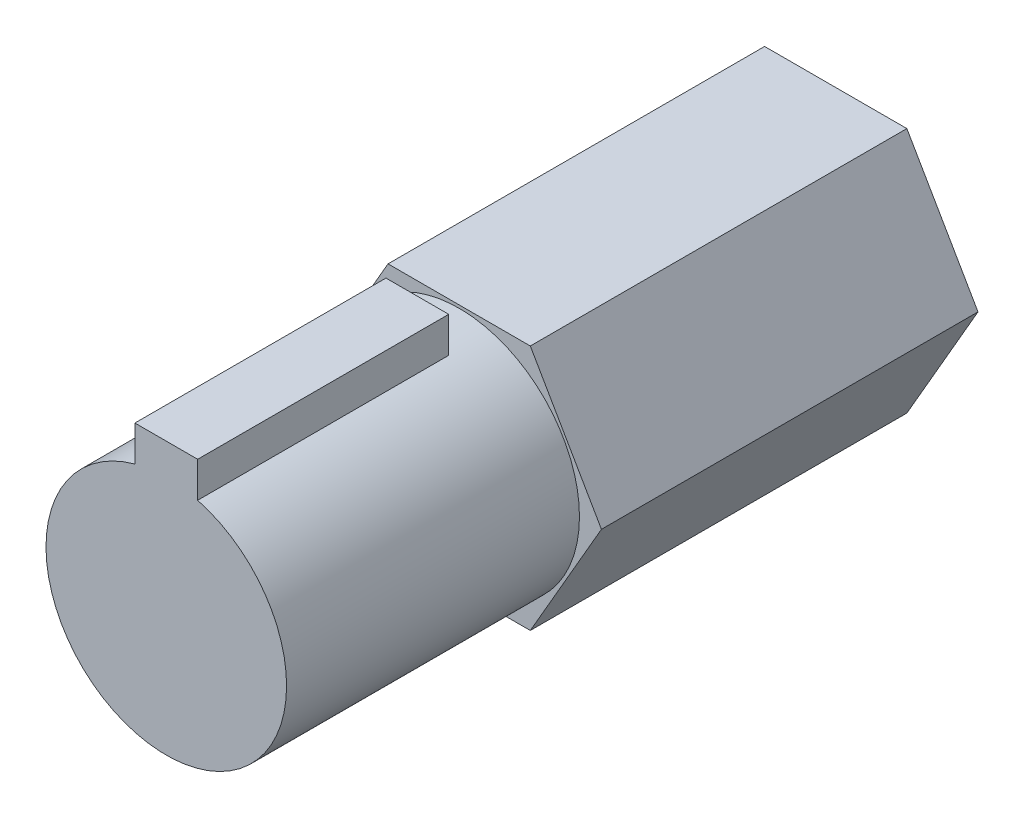
ISO-10303-21;
HEADER;
FILE_DESCRIPTION(('STEP AP214'),'2;1');
FILE_NAME('part.step','',(''),(''),'','','');
FILE_SCHEMA(('AUTOMOTIVE_DESIGN { 1 0 10303 214 1 1 1 1 }'));
ENDSEC;
DATA;
#1=APPLICATION_CONTEXT('core data for automotive mechanical design processes');
#2=APPLICATION_PROTOCOL_DEFINITION('international standard','automotive_design',2000,#1);
#3=PRODUCT_CONTEXT('',#1,'mechanical');
#4=PRODUCT('Part','Part','',(#3));
#5=PRODUCT_RELATED_PRODUCT_CATEGORY('part','',(#4));
#6=PRODUCT_DEFINITION_FORMATION('','',#4);
#7=PRODUCT_DEFINITION_CONTEXT('part definition',#1,'design');
#8=PRODUCT_DEFINITION('design','',#6,#7);
#9=PRODUCT_DEFINITION_SHAPE('','',#8);
#10=(LENGTH_UNIT() NAMED_UNIT(*) SI_UNIT(.MILLI.,.METRE.));
#11=(NAMED_UNIT(*) PLANE_ANGLE_UNIT() SI_UNIT($,.RADIAN.));
#12=(NAMED_UNIT(*) SI_UNIT($,.STERADIAN.) SOLID_ANGLE_UNIT());
#13=UNCERTAINTY_MEASURE_WITH_UNIT(LENGTH_MEASURE(1.E-05),#10,'distance_accuracy_value','');
#14=(GEOMETRIC_REPRESENTATION_CONTEXT(3) GLOBAL_UNCERTAINTY_ASSIGNED_CONTEXT((#13)) GLOBAL_UNIT_ASSIGNED_CONTEXT((#10,
#11,#12)) REPRESENTATION_CONTEXT('',''));
#15=CARTESIAN_POINT('',(0.,0.,0.));
#16=DIRECTION('',(0.,0.,1.));
#17=DIRECTION('',(1.,0.,0.));
#18=AXIS2_PLACEMENT_3D('',#15,#16,#17);
#19=CARTESIAN_POINT('',(1.7,-2.94448637286709,9.));
#20=DIRECTION('',(-0.866025403784439,0.5,0.));
#21=DIRECTION('',(-0.5,-0.866025403784439,0.));
#22=AXIS2_PLACEMENT_3D('',#19,#20,#21);
#23=PLANE('',#22);
#24=DIRECTION('',(0.5,0.866025403784439,0.));
#25=VECTOR('',#24,1.);
#26=CARTESIAN_POINT('',(1.7,-2.94448637286709,0.));
#27=LINE('',#26,#25);
#28=CARTESIAN_POINT('',(1.7,-2.94448637286709,0.));
#29=VERTEX_POINT('',#28);
#30=CARTESIAN_POINT('',(3.4,0.,0.));
#31=VERTEX_POINT('',#30);
#32=EDGE_CURVE('E146',#29,#31,#27,.T.);
#33=ORIENTED_EDGE('',*,*,#32,.T.);
#34=DIRECTION('',(0.,0.,-1.));
#35=VECTOR('',#34,1.);
#36=CARTESIAN_POINT('',(3.4,0.,9.));
#37=LINE('',#36,#35);
#38=CARTESIAN_POINT('',(3.4,0.,9.));
#39=VERTEX_POINT('',#38);
#40=EDGE_CURVE('E174',#39,#31,#37,.T.);
#41=ORIENTED_EDGE('',*,*,#40,.F.);
#42=DIRECTION('',(0.5,0.866025403784439,0.));
#43=VECTOR('',#42,1.);
#44=CARTESIAN_POINT('',(1.7,-2.94448637286709,9.));
#45=LINE('',#44,#43);
#46=CARTESIAN_POINT('',(1.7,-2.94448637286709,9.));
#47=VERTEX_POINT('',#46);
#48=EDGE_CURVE('E164',#47,#39,#45,.T.);
#49=ORIENTED_EDGE('',*,*,#48,.F.);
#50=DIRECTION('',(0.,0.,-1.));
#51=VECTOR('',#50,1.);
#52=CARTESIAN_POINT('',(1.7,-2.94448637286709,9.));
#53=LINE('',#52,#51);
#54=EDGE_CURVE('E142',#47,#29,#53,.T.);
#55=ORIENTED_EDGE('',*,*,#54,.T.);
#56=EDGE_LOOP('',(#33,#41,#49,#55));
#57=FACE_BOUND('',#56,.T.);
#58=ADVANCED_FACE('F45',(#57),#23,.F.);
#59=CARTESIAN_POINT('',(3.4,0.,9.));
#60=DIRECTION('',(-0.866025403784438,-0.5,0.));
#61=DIRECTION('',(0.500000000000001,-0.866025403784438,0.));
#62=AXIS2_PLACEMENT_3D('',#59,#60,#61);
#63=PLANE('',#62);
#64=DIRECTION('',(-0.5,0.866025403784438,0.));
#65=VECTOR('',#64,1.);
#66=CARTESIAN_POINT('',(3.4,0.,0.));
#67=LINE('',#66,#65);
#68=CARTESIAN_POINT('',(1.7,2.94448637286709,0.));
#69=VERTEX_POINT('',#68);
#70=EDGE_CURVE('E150',#31,#69,#67,.T.);
#71=ORIENTED_EDGE('',*,*,#70,.T.);
#72=DIRECTION('',(0.,0.,-1.));
#73=VECTOR('',#72,1.);
#74=CARTESIAN_POINT('',(1.7,2.94448637286709,9.));
#75=LINE('',#74,#73);
#76=CARTESIAN_POINT('',(1.7,2.94448637286709,9.));
#77=VERTEX_POINT('',#76);
#78=EDGE_CURVE('E171',#77,#69,#75,.T.);
#79=ORIENTED_EDGE('',*,*,#78,.F.);
#80=DIRECTION('',(-0.5,0.866025403784438,0.));
#81=VECTOR('',#80,1.);
#82=CARTESIAN_POINT('',(3.4,0.,9.));
#83=LINE('',#82,#81);
#84=EDGE_CURVE('E105',#39,#77,#83,.T.);
#85=ORIENTED_EDGE('',*,*,#84,.F.);
#86=ORIENTED_EDGE('',*,*,#40,.T.);
#87=EDGE_LOOP('',(#71,#79,#85,#86));
#88=FACE_BOUND('',#87,.T.);
#89=ADVANCED_FACE('F266',(#88),#63,.F.);
#90=CARTESIAN_POINT('',(1.7,2.94448637286709,9.));
#91=DIRECTION('',(0.,-1.,0.));
#92=DIRECTION('',(1.,0.,0.));
#93=AXIS2_PLACEMENT_3D('',#90,#91,#92);
#94=PLANE('',#93);
#95=DIRECTION('',(-1.,0.,0.));
#96=VECTOR('',#95,1.);
#97=CARTESIAN_POINT('',(1.7,2.94448637286709,0.));
#98=LINE('',#97,#96);
#99=CARTESIAN_POINT('',(-1.7,2.94448637286709,0.));
#100=VERTEX_POINT('',#99);
#101=EDGE_CURVE('E154',#69,#100,#98,.T.);
#102=ORIENTED_EDGE('',*,*,#101,.T.);
#103=DIRECTION('',(0.,0.,-1.));
#104=VECTOR('',#103,1.);
#105=CARTESIAN_POINT('',(-1.7,2.94448637286709,9.));
#106=LINE('',#105,#104);
#107=CARTESIAN_POINT('',(-1.7,2.94448637286709,9.));
#108=VERTEX_POINT('',#107);
#109=EDGE_CURVE('E135',#108,#100,#106,.T.);
#110=ORIENTED_EDGE('',*,*,#109,.F.);
#111=DIRECTION('',(-1.,0.,0.));
#112=VECTOR('',#111,1.);
#113=CARTESIAN_POINT('',(1.7,2.94448637286709,9.));
#114=LINE('',#113,#112);
#115=EDGE_CURVE('E121',#77,#108,#114,.T.);
#116=ORIENTED_EDGE('',*,*,#115,.F.);
#117=ORIENTED_EDGE('',*,*,#78,.T.);
#118=EDGE_LOOP('',(#102,#110,#116,#117));
#119=FACE_BOUND('',#118,.T.);
#120=ADVANCED_FACE('F271',(#119),#94,.F.);
#121=CARTESIAN_POINT('',(-1.7,2.94448637286709,9.));
#122=DIRECTION('',(0.866025403784439,-0.5,0.));
#123=DIRECTION('',(0.5,0.866025403784439,0.));
#124=AXIS2_PLACEMENT_3D('',#121,#122,#123);
#125=PLANE('',#124);
#126=DIRECTION('',(-0.5,-0.866025403784438,0.));
#127=VECTOR('',#126,1.);
#128=CARTESIAN_POINT('',(-1.7,2.94448637286709,0.));
#129=LINE('',#128,#127);
#130=CARTESIAN_POINT('',(-3.4,0.,0.));
#131=VERTEX_POINT('',#130);
#132=EDGE_CURVE('E131',#100,#131,#129,.T.);
#133=ORIENTED_EDGE('',*,*,#132,.T.);
#134=DIRECTION('',(0.,0.,-1.));
#135=VECTOR('',#134,1.);
#136=CARTESIAN_POINT('',(-3.4,0.,9.));
#137=LINE('',#136,#135);
#138=CARTESIAN_POINT('',(-3.4,0.,9.));
#139=VERTEX_POINT('',#138);
#140=EDGE_CURVE('E128',#139,#131,#137,.T.);
#141=ORIENTED_EDGE('',*,*,#140,.F.);
#142=DIRECTION('',(-0.5,-0.866025403784438,0.));
#143=VECTOR('',#142,1.);
#144=CARTESIAN_POINT('',(-1.7,2.94448637286709,9.));
#145=LINE('',#144,#143);
#146=EDGE_CURVE('E114',#108,#139,#145,.T.);
#147=ORIENTED_EDGE('',*,*,#146,.F.);
#148=ORIENTED_EDGE('',*,*,#109,.T.);
#149=EDGE_LOOP('',(#133,#141,#147,#148));
#150=FACE_BOUND('',#149,.T.);
#151=ADVANCED_FACE('F129',(#150),#125,.F.);
#152=CARTESIAN_POINT('',(-3.4,0.,9.));
#153=DIRECTION('',(0.866025403784439,0.5,0.));
#154=DIRECTION('',(-0.5,0.866025403784439,0.));
#155=AXIS2_PLACEMENT_3D('',#152,#153,#154);
#156=PLANE('',#155);
#157=DIRECTION('',(0.5,-0.866025403784439,0.));
#158=VECTOR('',#157,1.);
#159=CARTESIAN_POINT('',(-3.4,0.,0.));
#160=LINE('',#159,#158);
#161=CARTESIAN_POINT('',(-1.7,-2.94448637286709,0.));
#162=VERTEX_POINT('',#161);
#163=EDGE_CURVE('E159',#131,#162,#160,.T.);
#164=ORIENTED_EDGE('',*,*,#163,.T.);
#165=DIRECTION('',(0.,0.,-1.));
#166=VECTOR('',#165,1.);
#167=CARTESIAN_POINT('',(-1.7,-2.94448637286709,9.));
#168=LINE('',#167,#166);
#169=CARTESIAN_POINT('',(-1.7,-2.94448637286709,9.));
#170=VERTEX_POINT('',#169);
#171=EDGE_CURVE('E136',#170,#162,#168,.T.);
#172=ORIENTED_EDGE('',*,*,#171,.F.);
#173=DIRECTION('',(0.5,-0.866025403784439,0.));
#174=VECTOR('',#173,1.);
#175=CARTESIAN_POINT('',(-3.4,0.,9.));
#176=LINE('',#175,#174);
#177=EDGE_CURVE('E118',#139,#170,#176,.T.);
#178=ORIENTED_EDGE('',*,*,#177,.F.);
#179=ORIENTED_EDGE('',*,*,#140,.T.);
#180=EDGE_LOOP('',(#164,#172,#178,#179));
#181=FACE_BOUND('',#180,.T.);
#182=ADVANCED_FACE('F138',(#181),#156,.F.);
#183=CARTESIAN_POINT('',(-1.7,-2.94448637286709,9.));
#184=DIRECTION('',(0.,1.,0.));
#185=DIRECTION('',(0.,0.,1.));
#186=AXIS2_PLACEMENT_3D('',#183,#184,#185);
#187=PLANE('',#186);
#188=DIRECTION('',(1.,0.,0.));
#189=VECTOR('',#188,1.);
#190=CARTESIAN_POINT('',(-1.7,-2.94448637286709,0.));
#191=LINE('',#190,#189);
#192=EDGE_CURVE('E96',#162,#29,#191,.T.);
#193=ORIENTED_EDGE('',*,*,#192,.T.);
#194=ORIENTED_EDGE('',*,*,#54,.F.);
#195=DIRECTION('',(1.,0.,0.));
#196=VECTOR('',#195,1.);
#197=CARTESIAN_POINT('',(-1.7,-2.94448637286709,9.));
#198=LINE('',#197,#196);
#199=EDGE_CURVE('E69',#170,#47,#198,.T.);
#200=ORIENTED_EDGE('',*,*,#199,.F.);
#201=ORIENTED_EDGE('',*,*,#171,.T.);
#202=EDGE_LOOP('',(#193,#194,#200,#201));
#203=FACE_BOUND('',#202,.T.);
#204=ADVANCED_FACE('F278',(#203),#187,.F.);
#205=CARTESIAN_POINT('',(0.,0.,9.));
#206=DIRECTION('',(0.,0.,1.));
#207=DIRECTION('',(1.,0.,0.));
#208=AXIS2_PLACEMENT_3D('',#205,#206,#207);
#209=PLANE('',#208);
#210=CARTESIAN_POINT('',(0.,0.,9.));
#211=DIRECTION('',(0.,0.,1.));
#212=DIRECTION('',(1.,0.,0.));
#213=AXIS2_PLACEMENT_3D('',#210,#211,#212);
#214=CIRCLE('',#213,2.875);
#215=CARTESIAN_POINT('',(2.875,0.,9.));
#216=VERTEX_POINT('',#215);
#217=EDGE_CURVE('E53',#216,#216,#214,.T.);
#218=ORIENTED_EDGE('',*,*,#217,.F.);
#219=EDGE_LOOP('',(#218));
#220=FACE_BOUND('',#219,.T.);
#221=ORIENTED_EDGE('',*,*,#48,.T.);
#222=ORIENTED_EDGE('',*,*,#84,.T.);
#223=ORIENTED_EDGE('',*,*,#115,.T.);
#224=ORIENTED_EDGE('',*,*,#146,.T.);
#225=ORIENTED_EDGE('',*,*,#177,.T.);
#226=ORIENTED_EDGE('',*,*,#199,.T.);
#227=EDGE_LOOP('',(#221,#222,#223,#224,#225,#226));
#228=FACE_BOUND('',#227,.T.);
#229=ADVANCED_FACE('F116',(#220,#228),#209,.T.);
#230=CARTESIAN_POINT('',(0.,0.,0.));
#231=DIRECTION('',(0.,0.,1.));
#232=DIRECTION('',(1.,0.,0.));
#233=AXIS2_PLACEMENT_3D('',#230,#231,#232);
#234=PLANE('',#233);
#235=ORIENTED_EDGE('',*,*,#32,.F.);
#236=ORIENTED_EDGE('',*,*,#192,.F.);
#237=ORIENTED_EDGE('',*,*,#163,.F.);
#238=ORIENTED_EDGE('',*,*,#132,.F.);
#239=ORIENTED_EDGE('',*,*,#101,.F.);
#240=ORIENTED_EDGE('',*,*,#70,.F.);
#241=EDGE_LOOP('',(#235,#236,#237,#238,#239,#240));
#242=FACE_BOUND('',#241,.T.);
#243=ADVANCED_FACE('F275',(#242),#234,.F.);
#244=CARTESIAN_POINT('',(0.,0.,16.));
#245=DIRECTION('',(0.,0.,-1.));
#246=DIRECTION('',(-1.,0.,0.));
#247=AXIS2_PLACEMENT_3D('',#244,#245,#246);
#248=CYLINDRICAL_SURFACE('',#247,2.875);
#249=CARTESIAN_POINT('',(0.,0.,10.));
#250=DIRECTION('',(0.,0.,1.));
#251=DIRECTION('',(1.,0.,0.));
#252=AXIS2_PLACEMENT_3D('',#249,#250,#251);
#253=CIRCLE('',#252,2.875);
#254=CARTESIAN_POINT('',(0.749999999999987,2.77545041389682,10.));
#255=VERTEX_POINT('',#254);
#256=CARTESIAN_POINT('',(-0.749999999999986,2.77545041389682,10.));
#257=VERTEX_POINT('',#256);
#258=EDGE_CURVE('E11',#255,#257,#253,.T.);
#259=ORIENTED_EDGE('',*,*,#258,.F.);
#260=DIRECTION('',(0.,0.,-1.));
#261=VECTOR('',#260,1.);
#262=CARTESIAN_POINT('',(0.749999999999987,2.77545041389682,16.));
#263=LINE('',#262,#261);
#264=CARTESIAN_POINT('',(0.749999999999987,2.77545041389682,16.));
#265=VERTEX_POINT('',#264);
#266=EDGE_CURVE('E191',#255,#265,#263,.F.);
#267=ORIENTED_EDGE('',*,*,#266,.T.);
#268=CARTESIAN_POINT('',(0.,0.,16.));
#269=DIRECTION('',(0.,0.,1.));
#270=DIRECTION('',(1.,0.,0.));
#271=AXIS2_PLACEMENT_3D('',#268,#269,#270);
#272=CIRCLE('',#271,2.875);
#273=CARTESIAN_POINT('',(-0.749999999999986,2.77545041389682,16.));
#274=VERTEX_POINT('',#273);
#275=EDGE_CURVE('E151',#274,#265,#272,.T.);
#276=ORIENTED_EDGE('',*,*,#275,.F.);
#277=DIRECTION('',(0.,0.,-1.));
#278=VECTOR('',#277,1.);
#279=CARTESIAN_POINT('',(-0.749999999999986,2.77545041389682,16.));
#280=LINE('',#279,#278);
#281=EDGE_CURVE('E194',#274,#257,#280,.T.);
#282=ORIENTED_EDGE('',*,*,#281,.T.);
#283=EDGE_LOOP('',(#259,#267,#276,#282));
#284=FACE_BOUND('',#283,.T.);
#285=ORIENTED_EDGE('',*,*,#217,.T.);
#286=EDGE_LOOP('',(#285));
#287=FACE_BOUND('',#286,.T.);
#288=ADVANCED_FACE('F252',(#284,#287),#248,.T.);
#289=CARTESIAN_POINT('',(0.,0.,16.));
#290=DIRECTION('',(0.,0.,1.));
#291=DIRECTION('',(1.,0.,0.));
#292=AXIS2_PLACEMENT_3D('',#289,#290,#291);
#293=PLANE('',#292);
#294=ORIENTED_EDGE('',*,*,#275,.T.);
#295=DIRECTION('',(0.,1.,0.));
#296=VECTOR('',#295,1.);
#297=CARTESIAN_POINT('',(0.749999999999987,3.62499999999999,16.));
#298=LINE('',#297,#296);
#299=CARTESIAN_POINT('',(0.749999999999987,3.62499999999999,16.));
#300=VERTEX_POINT('',#299);
#301=EDGE_CURVE('E222',#265,#300,#298,.T.);
#302=ORIENTED_EDGE('',*,*,#301,.T.);
#303=DIRECTION('',(-1.,0.,0.));
#304=VECTOR('',#303,1.);
#305=CARTESIAN_POINT('',(-0.749999999999987,3.62499999999999,16.));
#306=LINE('',#305,#304);
#307=CARTESIAN_POINT('',(-0.749999999999987,3.62499999999999,16.));
#308=VERTEX_POINT('',#307);
#309=EDGE_CURVE('E219',#300,#308,#306,.T.);
#310=ORIENTED_EDGE('',*,*,#309,.T.);
#311=DIRECTION('',(0.,-1.,0.));
#312=VECTOR('',#311,1.);
#313=CARTESIAN_POINT('',(-0.749999999999987,3.62499999999999,16.));
#314=LINE('',#313,#312);
#315=EDGE_CURVE('E60',#308,#274,#314,.T.);
#316=ORIENTED_EDGE('',*,*,#315,.T.);
#317=EDGE_LOOP('',(#294,#302,#310,#316));
#318=FACE_BOUND('',#317,.T.);
#319=ADVANCED_FACE('F228',(#318),#293,.T.);
#320=CARTESIAN_POINT('',(0.749999999999987,3.62499999999999,10.));
#321=DIRECTION('',(1.,0.,0.));
#322=DIRECTION('',(0.,1.,0.));
#323=AXIS2_PLACEMENT_3D('',#320,#321,#322);
#324=PLANE('',#323);
#325=ORIENTED_EDGE('',*,*,#266,.F.);
#326=DIRECTION('',(0.,1.,0.));
#327=VECTOR('',#326,1.);
#328=CARTESIAN_POINT('',(0.749999999999987,3.62499999999999,10.));
#329=LINE('',#328,#327);
#330=CARTESIAN_POINT('',(0.749999999999987,3.62499999999999,10.));
#331=VERTEX_POINT('',#330);
#332=EDGE_CURVE('E213',#255,#331,#329,.T.);
#333=ORIENTED_EDGE('',*,*,#332,.T.);
#334=DIRECTION('',(0.,0.,1.));
#335=VECTOR('',#334,1.);
#336=CARTESIAN_POINT('',(0.749999999999987,3.62499999999999,10.));
#337=LINE('',#336,#335);
#338=EDGE_CURVE('E201',#331,#300,#337,.T.);
#339=ORIENTED_EDGE('',*,*,#338,.T.);
#340=ORIENTED_EDGE('',*,*,#301,.F.);
#341=EDGE_LOOP('',(#325,#333,#339,#340));
#342=FACE_BOUND('',#341,.T.);
#343=ADVANCED_FACE('F237',(#342),#324,.T.);
#344=CARTESIAN_POINT('',(-0.749999999999987,3.62499999999999,10.));
#345=DIRECTION('',(-1.,0.,0.));
#346=DIRECTION('',(0.,-1.,0.));
#347=AXIS2_PLACEMENT_3D('',#344,#345,#346);
#348=PLANE('',#347);
#349=ORIENTED_EDGE('',*,*,#281,.F.);
#350=ORIENTED_EDGE('',*,*,#315,.F.);
#351=DIRECTION('',(0.,0.,1.));
#352=VECTOR('',#351,1.);
#353=CARTESIAN_POINT('',(-0.749999999999987,3.62499999999999,10.));
#354=LINE('',#353,#352);
#355=CARTESIAN_POINT('',(-0.749999999999987,3.62499999999999,10.));
#356=VERTEX_POINT('',#355);
#357=EDGE_CURVE('E197',#356,#308,#354,.T.);
#358=ORIENTED_EDGE('',*,*,#357,.F.);
#359=DIRECTION('',(0.,-1.,0.));
#360=VECTOR('',#359,1.);
#361=CARTESIAN_POINT('',(-0.749999999999987,3.62499999999999,10.));
#362=LINE('',#361,#360);
#363=EDGE_CURVE('E205',#356,#257,#362,.T.);
#364=ORIENTED_EDGE('',*,*,#363,.T.);
#365=EDGE_LOOP('',(#349,#350,#358,#364));
#366=FACE_BOUND('',#365,.T.);
#367=ADVANCED_FACE('F248',(#366),#348,.T.);
#368=CARTESIAN_POINT('',(-0.749999999999987,3.62499999999999,10.));
#369=DIRECTION('',(0.,1.,0.));
#370=DIRECTION('',(-1.,0.,0.));
#371=AXIS2_PLACEMENT_3D('',#368,#369,#370);
#372=PLANE('',#371);
#373=ORIENTED_EDGE('',*,*,#309,.F.);
#374=ORIENTED_EDGE('',*,*,#338,.F.);
#375=DIRECTION('',(-1.,0.,0.));
#376=VECTOR('',#375,1.);
#377=CARTESIAN_POINT('',(-0.749999999999987,3.62499999999999,10.));
#378=LINE('',#377,#376);
#379=EDGE_CURVE('E209',#331,#356,#378,.T.);
#380=ORIENTED_EDGE('',*,*,#379,.T.);
#381=ORIENTED_EDGE('',*,*,#357,.T.);
#382=EDGE_LOOP('',(#373,#374,#380,#381));
#383=FACE_BOUND('',#382,.T.);
#384=ADVANCED_FACE('F242',(#383),#372,.T.);
#385=CARTESIAN_POINT('',(0.,0.,10.));
#386=DIRECTION('',(0.,0.,1.));
#387=DIRECTION('',(1.,0.,0.));
#388=AXIS2_PLACEMENT_3D('',#385,#386,#387);
#389=PLANE('',#388);
#390=ORIENTED_EDGE('',*,*,#332,.F.);
#391=ORIENTED_EDGE('',*,*,#258,.T.);
#392=ORIENTED_EDGE('',*,*,#363,.F.);
#393=ORIENTED_EDGE('',*,*,#379,.F.);
#394=EDGE_LOOP('',(#390,#391,#392,#393));
#395=FACE_BOUND('',#394,.T.);
#396=ADVANCED_FACE('F254',(#395),#389,.F.);
#397=CLOSED_SHELL('',(#58,#89,#120,#151,#182,#204,#229,#243,#288,#319,#343,#367,#384,#396));
#398=MANIFOLD_SOLID_BREP('B2',#397);
#399=ADVANCED_BREP_SHAPE_REPRESENTATION('',(#18,#398),#14);
#400=SHAPE_DEFINITION_REPRESENTATION(#9,#399);
ENDSEC;
END-ISO-10303-21;
